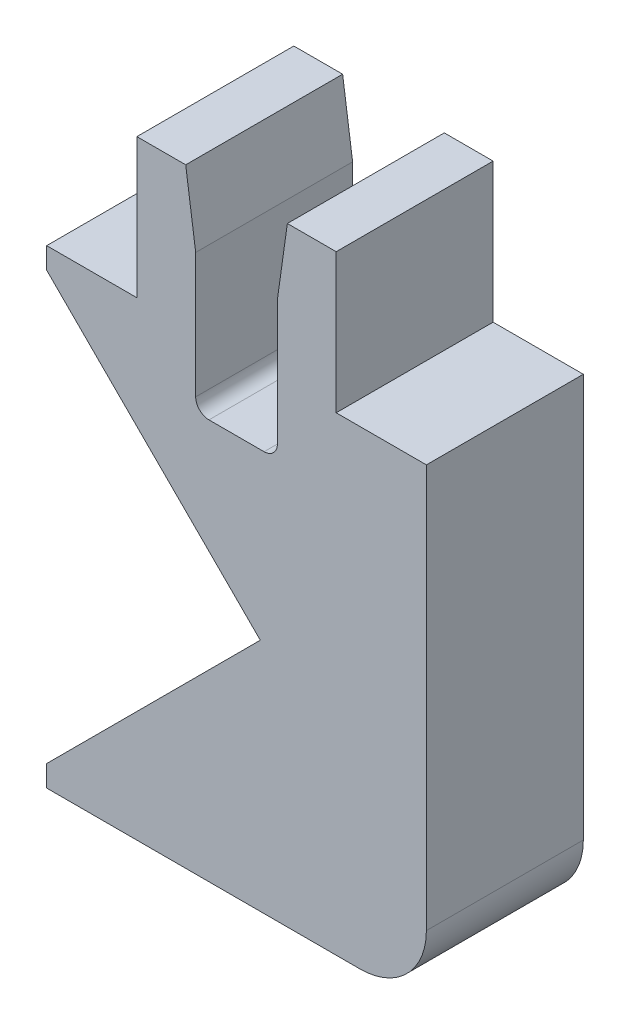
ISO-10303-21;
HEADER;
FILE_DESCRIPTION(('STEP AP214'),'2;1');
FILE_NAME('part.step','',(''),(''),'','','');
FILE_SCHEMA(('AUTOMOTIVE_DESIGN { 1 0 10303 214 1 1 1 1 }'));
ENDSEC;
DATA;
#1=APPLICATION_CONTEXT('core data for automotive mechanical design processes');
#2=APPLICATION_PROTOCOL_DEFINITION('international standard','automotive_design',2000,#1);
#3=PRODUCT_CONTEXT('',#1,'mechanical');
#4=PRODUCT('Part','Part','',(#3));
#5=PRODUCT_RELATED_PRODUCT_CATEGORY('part','',(#4));
#6=PRODUCT_DEFINITION_FORMATION('','',#4);
#7=PRODUCT_DEFINITION_CONTEXT('part definition',#1,'design');
#8=PRODUCT_DEFINITION('design','',#6,#7);
#9=PRODUCT_DEFINITION_SHAPE('','',#8);
#10=(LENGTH_UNIT() NAMED_UNIT(*) SI_UNIT(.MILLI.,.METRE.));
#11=(NAMED_UNIT(*) PLANE_ANGLE_UNIT() SI_UNIT($,.RADIAN.));
#12=(NAMED_UNIT(*) SI_UNIT($,.STERADIAN.) SOLID_ANGLE_UNIT());
#13=UNCERTAINTY_MEASURE_WITH_UNIT(LENGTH_MEASURE(1.E-05),#10,'distance_accuracy_value','');
#14=(GEOMETRIC_REPRESENTATION_CONTEXT(3) GLOBAL_UNCERTAINTY_ASSIGNED_CONTEXT((#13)) GLOBAL_UNIT_ASSIGNED_CONTEXT((#10,
#11,#12)) REPRESENTATION_CONTEXT('',''));
#15=CARTESIAN_POINT('',(0.,0.,0.));
#16=DIRECTION('',(0.,0.,1.));
#17=DIRECTION('',(1.,0.,0.));
#18=AXIS2_PLACEMENT_3D('',#15,#16,#17);
#19=CARTESIAN_POINT('',(-4.71872806053456,14.3142561210692,6.));
#20=DIRECTION('',(0.,-1.,0.));
#21=DIRECTION('',(0.,0.,-1.));
#22=AXIS2_PLACEMENT_3D('',#19,#20,#21);
#23=PLANE('',#22);
#24=DIRECTION('',(-1.,0.,0.));
#25=VECTOR('',#24,1.);
#26=CARTESIAN_POINT('',(-4.71872806053456,14.3142561210692,6.));
#27=LINE('',#26,#25);
#28=CARTESIAN_POINT('',(-2.85182806053456,14.3142561210692,6.));
#29=VERTEX_POINT('',#28);
#30=CARTESIAN_POINT('',(-4.71872806053456,14.3142561210692,6.));
#31=VERTEX_POINT('',#30);
#32=EDGE_CURVE('E282',#29,#31,#27,.T.);
#33=ORIENTED_EDGE('',*,*,#32,.F.);
#34=DIRECTION('',(0.,0.,-1.));
#35=VECTOR('',#34,1.);
#36=CARTESIAN_POINT('',(-2.85182806053456,14.3142561210692,6.));
#37=LINE('',#36,#35);
#38=CARTESIAN_POINT('',(-2.85182806053456,14.3142561210692,0.));
#39=VERTEX_POINT('',#38);
#40=EDGE_CURVE('E231',#29,#39,#37,.T.);
#41=ORIENTED_EDGE('',*,*,#40,.T.);
#42=DIRECTION('',(-1.,0.,0.));
#43=VECTOR('',#42,1.);
#44=CARTESIAN_POINT('',(-4.71872806053456,14.3142561210692,0.));
#45=LINE('',#44,#43);
#46=CARTESIAN_POINT('',(-4.71872806053456,14.3142561210692,0.));
#47=VERTEX_POINT('',#46);
#48=EDGE_CURVE('E305',#39,#47,#45,.T.);
#49=ORIENTED_EDGE('',*,*,#48,.T.);
#50=DIRECTION('',(0.,0.,-1.));
#51=VECTOR('',#50,1.);
#52=CARTESIAN_POINT('',(-4.71872806053456,14.3142561210692,6.));
#53=LINE('',#52,#51);
#54=EDGE_CURVE('E326',#31,#47,#53,.T.);
#55=ORIENTED_EDGE('',*,*,#54,.F.);
#56=EDGE_LOOP('',(#33,#41,#49,#55));
#57=FACE_BOUND('',#56,.T.);
#58=ADVANCED_FACE('F36',(#57),#23,.F.);
#59=CARTESIAN_POINT('',(-8.16745612106912,-8.16745612106902,6.));
#60=DIRECTION('',(0.707106781186544,-0.707106781186551,0.));
#61=DIRECTION('',(0.707106781186551,0.707106781186544,0.));
#62=AXIS2_PLACEMENT_3D('',#59,#60,#61);
#63=PLANE('',#62);
#64=DIRECTION('',(-0.707106781186551,-0.707106781186544,0.));
#65=VECTOR('',#64,1.);
#66=CARTESIAN_POINT('',(-8.16745612106912,-8.16745612106902,0.));
#67=LINE('',#66,#65);
#68=CARTESIAN_POINT('',(0.,0.,0.));
#69=VERTEX_POINT('',#68);
#70=CARTESIAN_POINT('',(-8.16745612106912,-8.16745612106902,0.));
#71=VERTEX_POINT('',#70);
#72=EDGE_CURVE('E198',#69,#71,#67,.T.);
#73=ORIENTED_EDGE('',*,*,#72,.T.);
#74=DIRECTION('',(0.,0.,-1.));
#75=VECTOR('',#74,1.);
#76=CARTESIAN_POINT('',(-8.16745612106912,-8.16745612106902,6.));
#77=LINE('',#76,#75);
#78=CARTESIAN_POINT('',(-8.16745612106912,-8.16745612106902,6.));
#79=VERTEX_POINT('',#78);
#80=EDGE_CURVE('E177',#79,#71,#77,.T.);
#81=ORIENTED_EDGE('',*,*,#80,.F.);
#82=DIRECTION('',(-0.707106781186551,-0.707106781186544,0.));
#83=VECTOR('',#82,1.);
#84=CARTESIAN_POINT('',(-8.16745612106912,-8.16745612106902,6.));
#85=LINE('',#84,#83);
#86=CARTESIAN_POINT('',(0.,0.,6.));
#87=VERTEX_POINT('',#86);
#88=EDGE_CURVE('E184',#87,#79,#85,.T.);
#89=ORIENTED_EDGE('',*,*,#88,.F.);
#90=DIRECTION('',(0.,0.,-1.));
#91=VECTOR('',#90,1.);
#92=CARTESIAN_POINT('',(0.,0.,6.));
#93=LINE('',#92,#91);
#94=EDGE_CURVE('E292',#87,#69,#93,.T.);
#95=ORIENTED_EDGE('',*,*,#94,.T.);
#96=EDGE_LOOP('',(#73,#81,#89,#95));
#97=FACE_BOUND('',#96,.T.);
#98=ADVANCED_FACE('F196',(#97),#63,.F.);
#99=CARTESIAN_POINT('',(-8.16745612106911,-8.98025612106903,6.));
#100=DIRECTION('',(1.,0.,0.));
#101=DIRECTION('',(0.,1.,0.));
#102=AXIS2_PLACEMENT_3D('',#99,#100,#101);
#103=PLANE('',#102);
#104=DIRECTION('',(0.,-1.,0.));
#105=VECTOR('',#104,1.);
#106=CARTESIAN_POINT('',(-8.16745612106911,-8.98025612106903,0.));
#107=LINE('',#106,#105);
#108=CARTESIAN_POINT('',(-8.16745612106911,-8.98025612106903,0.));
#109=VERTEX_POINT('',#108);
#110=EDGE_CURVE('E294',#71,#109,#107,.T.);
#111=ORIENTED_EDGE('',*,*,#110,.T.);
#112=DIRECTION('',(0.,0.,-1.));
#113=VECTOR('',#112,1.);
#114=CARTESIAN_POINT('',(-8.16745612106911,-8.98025612106903,6.));
#115=LINE('',#114,#113);
#116=CARTESIAN_POINT('',(-8.16745612106911,-8.98025612106903,6.));
#117=VERTEX_POINT('',#116);
#118=EDGE_CURVE('E180',#117,#109,#115,.T.);
#119=ORIENTED_EDGE('',*,*,#118,.F.);
#120=DIRECTION('',(0.,-1.,0.));
#121=VECTOR('',#120,1.);
#122=CARTESIAN_POINT('',(-8.16745612106911,-8.98025612106903,6.));
#123=LINE('',#122,#121);
#124=EDGE_CURVE('E173',#79,#117,#123,.T.);
#125=ORIENTED_EDGE('',*,*,#124,.F.);
#126=ORIENTED_EDGE('',*,*,#80,.T.);
#127=EDGE_LOOP('',(#111,#119,#125,#126));
#128=FACE_BOUND('',#127,.T.);
#129=ADVANCED_FACE('F175',(#128),#103,.F.);
#130=CARTESIAN_POINT('',(6.35,-8.98025612106902,6.));
#131=DIRECTION('',(0.,1.,0.));
#132=DIRECTION('',(-1.,0.,0.));
#133=AXIS2_PLACEMENT_3D('',#130,#131,#132);
#134=PLANE('',#133);
#135=DIRECTION('',(1.,0.,0.));
#136=VECTOR('',#135,1.);
#137=CARTESIAN_POINT('',(6.35,-8.98025612106902,0.));
#138=LINE('',#137,#136);
#139=CARTESIAN_POINT('',(3.81,-8.98025612106902,0.));
#140=VERTEX_POINT('',#139);
#141=EDGE_CURVE('E296',#109,#140,#138,.T.);
#142=ORIENTED_EDGE('',*,*,#141,.T.);
#143=DIRECTION('',(0.,0.,-1.));
#144=VECTOR('',#143,1.);
#145=CARTESIAN_POINT('',(3.81,-8.98025612106902,6.));
#146=LINE('',#145,#144);
#147=CARTESIAN_POINT('',(3.81,-8.98025612106902,6.));
#148=VERTEX_POINT('',#147);
#149=EDGE_CURVE('E209',#140,#148,#146,.F.);
#150=ORIENTED_EDGE('',*,*,#149,.T.);
#151=DIRECTION('',(1.,0.,0.));
#152=VECTOR('',#151,1.);
#153=CARTESIAN_POINT('',(6.35,-8.98025612106902,6.));
#154=LINE('',#153,#152);
#155=EDGE_CURVE('E183',#117,#148,#154,.T.);
#156=ORIENTED_EDGE('',*,*,#155,.F.);
#157=ORIENTED_EDGE('',*,*,#118,.T.);
#158=EDGE_LOOP('',(#142,#150,#156,#157));
#159=FACE_BOUND('',#158,.T.);
#160=ADVANCED_FACE('F362',(#159),#134,.F.);
#161=CARTESIAN_POINT('',(6.35,8.98025612106916,6.));
#162=DIRECTION('',(-1.,0.,0.));
#163=DIRECTION('',(0.,0.,1.));
#164=AXIS2_PLACEMENT_3D('',#161,#162,#163);
#165=PLANE('',#164);
#166=DIRECTION('',(0.,1.,0.));
#167=VECTOR('',#166,1.);
#168=CARTESIAN_POINT('',(6.35,8.98025612106916,6.));
#169=LINE('',#168,#167);
#170=CARTESIAN_POINT('',(6.35,-6.44025612106902,6.));
#171=VERTEX_POINT('',#170);
#172=CARTESIAN_POINT('',(6.35,8.98025612106916,6.));
#173=VERTEX_POINT('',#172);
#174=EDGE_CURVE('E276',#171,#173,#169,.T.);
#175=ORIENTED_EDGE('',*,*,#174,.F.);
#176=DIRECTION('',(0.,0.,-1.));
#177=VECTOR('',#176,1.);
#178=CARTESIAN_POINT('',(6.35,-6.44025612106902,6.));
#179=LINE('',#178,#177);
#180=CARTESIAN_POINT('',(6.35,-6.44025612106902,0.));
#181=VERTEX_POINT('',#180);
#182=EDGE_CURVE('E199',#171,#181,#179,.T.);
#183=ORIENTED_EDGE('',*,*,#182,.T.);
#184=DIRECTION('',(0.,1.,0.));
#185=VECTOR('',#184,1.);
#186=CARTESIAN_POINT('',(6.35,8.98025612106916,0.));
#187=LINE('',#186,#185);
#188=CARTESIAN_POINT('',(6.35,8.98025612106916,0.));
#189=VERTEX_POINT('',#188);
#190=EDGE_CURVE('E299',#181,#189,#187,.T.);
#191=ORIENTED_EDGE('',*,*,#190,.T.);
#192=DIRECTION('',(0.,0.,-1.));
#193=VECTOR('',#192,1.);
#194=CARTESIAN_POINT('',(6.35,8.98025612106916,6.));
#195=LINE('',#194,#193);
#196=EDGE_CURVE('E204',#173,#189,#195,.T.);
#197=ORIENTED_EDGE('',*,*,#196,.F.);
#198=EDGE_LOOP('',(#175,#183,#191,#197));
#199=FACE_BOUND('',#198,.T.);
#200=ADVANCED_FACE('F356',(#199),#165,.F.);
#201=CARTESIAN_POINT('',(2.90127193946544,8.98025612106916,6.));
#202=DIRECTION('',(0.,-1.,0.));
#203=DIRECTION('',(0.,0.,-1.));
#204=AXIS2_PLACEMENT_3D('',#201,#202,#203);
#205=PLANE('',#204);
#206=DIRECTION('',(-1.,0.,0.));
#207=VECTOR('',#206,1.);
#208=CARTESIAN_POINT('',(2.90127193946544,8.98025612106916,0.));
#209=LINE('',#208,#207);
#210=CARTESIAN_POINT('',(2.90127193946544,8.98025612106916,0.));
#211=VERTEX_POINT('',#210);
#212=EDGE_CURVE('E301',#189,#211,#209,.T.);
#213=ORIENTED_EDGE('',*,*,#212,.T.);
#214=DIRECTION('',(0.,0.,-1.));
#215=VECTOR('',#214,1.);
#216=CARTESIAN_POINT('',(2.90127193946544,8.98025612106916,6.));
#217=LINE('',#216,#215);
#218=CARTESIAN_POINT('',(2.90127193946544,8.98025612106916,6.));
#219=VERTEX_POINT('',#218);
#220=EDGE_CURVE('E332',#219,#211,#217,.T.);
#221=ORIENTED_EDGE('',*,*,#220,.F.);
#222=DIRECTION('',(-1.,0.,0.));
#223=VECTOR('',#222,1.);
#224=CARTESIAN_POINT('',(2.90127193946544,8.98025612106916,6.));
#225=LINE('',#224,#223);
#226=EDGE_CURVE('E278',#173,#219,#225,.T.);
#227=ORIENTED_EDGE('',*,*,#226,.F.);
#228=ORIENTED_EDGE('',*,*,#196,.T.);
#229=EDGE_LOOP('',(#213,#221,#227,#228));
#230=FACE_BOUND('',#229,.T.);
#231=ADVANCED_FACE('F339',(#230),#205,.F.);
#232=CARTESIAN_POINT('',(2.90127193946544,14.3142561210692,6.));
#233=DIRECTION('',(-1.,0.,0.));
#234=DIRECTION('',(0.,-1.,0.));
#235=AXIS2_PLACEMENT_3D('',#232,#233,#234);
#236=PLANE('',#235);
#237=DIRECTION('',(0.,1.,0.));
#238=VECTOR('',#237,1.);
#239=CARTESIAN_POINT('',(2.90127193946544,14.3142561210692,0.));
#240=LINE('',#239,#238);
#241=CARTESIAN_POINT('',(2.90127193946544,14.3142561210692,0.));
#242=VERTEX_POINT('',#241);
#243=EDGE_CURVE('E303',#211,#242,#240,.T.);
#244=ORIENTED_EDGE('',*,*,#243,.T.);
#245=DIRECTION('',(0.,0.,-1.));
#246=VECTOR('',#245,1.);
#247=CARTESIAN_POINT('',(2.90127193946544,14.3142561210692,6.));
#248=LINE('',#247,#246);
#249=CARTESIAN_POINT('',(2.90127193946544,14.3142561210692,6.));
#250=VERTEX_POINT('',#249);
#251=EDGE_CURVE('E329',#250,#242,#248,.T.);
#252=ORIENTED_EDGE('',*,*,#251,.F.);
#253=DIRECTION('',(0.,1.,0.));
#254=VECTOR('',#253,1.);
#255=CARTESIAN_POINT('',(2.90127193946544,14.3142561210692,6.));
#256=LINE('',#255,#254);
#257=EDGE_CURVE('E280',#219,#250,#256,.T.);
#258=ORIENTED_EDGE('',*,*,#257,.F.);
#259=ORIENTED_EDGE('',*,*,#220,.T.);
#260=EDGE_LOOP('',(#244,#252,#258,#259));
#261=FACE_BOUND('',#260,.T.);
#262=ADVANCED_FACE('F348',(#261),#236,.F.);
#263=CARTESIAN_POINT('',(1.03437193946544,14.3142561210692,0.));
#264=VERTEX_POINT('',#263);
#265=EDGE_CURVE('E306',#242,#264,#45,.T.);
#266=ORIENTED_EDGE('',*,*,#265,.T.);
#267=DIRECTION('',(0.,0.,1.));
#268=VECTOR('',#267,1.);
#269=CARTESIAN_POINT('',(1.03437193946544,14.3142561210692,6.));
#270=LINE('',#269,#268);
#271=CARTESIAN_POINT('',(1.03437193946544,14.3142561210692,6.));
#272=VERTEX_POINT('',#271);
#273=EDGE_CURVE('E213',#264,#272,#270,.T.);
#274=ORIENTED_EDGE('',*,*,#273,.T.);
#275=EDGE_CURVE('E283',#250,#272,#27,.T.);
#276=ORIENTED_EDGE('',*,*,#275,.F.);
#277=ORIENTED_EDGE('',*,*,#251,.T.);
#278=EDGE_LOOP('',(#266,#274,#276,#277));
#279=FACE_BOUND('',#278,.T.);
#280=ADVANCED_FACE('F352',(#279),#23,.F.);
#281=CARTESIAN_POINT('',(-4.71872806053456,8.98025612106916,6.));
#282=DIRECTION('',(1.,0.,0.));
#283=DIRECTION('',(0.,0.,-1.));
#284=AXIS2_PLACEMENT_3D('',#281,#282,#283);
#285=PLANE('',#284);
#286=DIRECTION('',(0.,-1.,0.));
#287=VECTOR('',#286,1.);
#288=CARTESIAN_POINT('',(-4.71872806053456,8.98025612106916,0.));
#289=LINE('',#288,#287);
#290=CARTESIAN_POINT('',(-4.71872806053456,8.98025612106916,0.));
#291=VERTEX_POINT('',#290);
#292=EDGE_CURVE('E309',#47,#291,#289,.T.);
#293=ORIENTED_EDGE('',*,*,#292,.T.);
#294=DIRECTION('',(0.,0.,-1.));
#295=VECTOR('',#294,1.);
#296=CARTESIAN_POINT('',(-4.71872806053456,8.98025612106916,6.));
#297=LINE('',#296,#295);
#298=CARTESIAN_POINT('',(-4.71872806053456,8.98025612106916,6.));
#299=VERTEX_POINT('',#298);
#300=EDGE_CURVE('E323',#299,#291,#297,.T.);
#301=ORIENTED_EDGE('',*,*,#300,.F.);
#302=DIRECTION('',(0.,-1.,0.));
#303=VECTOR('',#302,1.);
#304=CARTESIAN_POINT('',(-4.71872806053456,8.98025612106916,6.));
#305=LINE('',#304,#303);
#306=EDGE_CURVE('E285',#31,#299,#305,.T.);
#307=ORIENTED_EDGE('',*,*,#306,.F.);
#308=ORIENTED_EDGE('',*,*,#54,.T.);
#309=EDGE_LOOP('',(#293,#301,#307,#308));
#310=FACE_BOUND('',#309,.T.);
#311=ADVANCED_FACE('F382',(#310),#285,.F.);
#312=CARTESIAN_POINT('',(-8.16745612106912,8.9802561210692,6.));
#313=DIRECTION('',(0.,-1.,0.));
#314=DIRECTION('',(1.,0.,0.));
#315=AXIS2_PLACEMENT_3D('',#312,#313,#314);
#316=PLANE('',#315);
#317=DIRECTION('',(-1.,0.,0.));
#318=VECTOR('',#317,1.);
#319=CARTESIAN_POINT('',(-8.16745612106912,8.9802561210692,0.));
#320=LINE('',#319,#318);
#321=CARTESIAN_POINT('',(-8.16745612106912,8.9802561210692,0.));
#322=VERTEX_POINT('',#321);
#323=EDGE_CURVE('E311',#291,#322,#320,.T.);
#324=ORIENTED_EDGE('',*,*,#323,.T.);
#325=DIRECTION('',(0.,0.,-1.));
#326=VECTOR('',#325,1.);
#327=CARTESIAN_POINT('',(-8.16745612106912,8.9802561210692,6.));
#328=LINE('',#327,#326);
#329=CARTESIAN_POINT('',(-8.16745612106912,8.9802561210692,6.));
#330=VERTEX_POINT('',#329);
#331=EDGE_CURVE('E320',#330,#322,#328,.T.);
#332=ORIENTED_EDGE('',*,*,#331,.F.);
#333=DIRECTION('',(-1.,0.,0.));
#334=VECTOR('',#333,1.);
#335=CARTESIAN_POINT('',(-8.16745612106912,8.9802561210692,6.));
#336=LINE('',#335,#334);
#337=EDGE_CURVE('E287',#299,#330,#336,.T.);
#338=ORIENTED_EDGE('',*,*,#337,.F.);
#339=ORIENTED_EDGE('',*,*,#300,.T.);
#340=EDGE_LOOP('',(#324,#332,#338,#339));
#341=FACE_BOUND('',#340,.T.);
#342=ADVANCED_FACE('F387',(#341),#316,.F.);
#343=CARTESIAN_POINT('',(-8.16745612106911,8.1674561210692,6.));
#344=DIRECTION('',(1.,0.,0.));
#345=DIRECTION('',(0.,1.,0.));
#346=AXIS2_PLACEMENT_3D('',#343,#344,#345);
#347=PLANE('',#346);
#348=DIRECTION('',(0.,-1.,0.));
#349=VECTOR('',#348,1.);
#350=CARTESIAN_POINT('',(-8.16745612106911,8.1674561210692,0.));
#351=LINE('',#350,#349);
#352=CARTESIAN_POINT('',(-8.16745612106911,8.1674561210692,0.));
#353=VERTEX_POINT('',#352);
#354=EDGE_CURVE('E313',#322,#353,#351,.T.);
#355=ORIENTED_EDGE('',*,*,#354,.T.);
#356=DIRECTION('',(0.,0.,-1.));
#357=VECTOR('',#356,1.);
#358=CARTESIAN_POINT('',(-8.16745612106911,8.1674561210692,6.));
#359=LINE('',#358,#357);
#360=CARTESIAN_POINT('',(-8.16745612106911,8.1674561210692,6.));
#361=VERTEX_POINT('',#360);
#362=EDGE_CURVE('E317',#361,#353,#359,.T.);
#363=ORIENTED_EDGE('',*,*,#362,.F.);
#364=DIRECTION('',(0.,-1.,0.));
#365=VECTOR('',#364,1.);
#366=CARTESIAN_POINT('',(-8.16745612106911,8.1674561210692,6.));
#367=LINE('',#366,#365);
#368=EDGE_CURVE('E289',#330,#361,#367,.T.);
#369=ORIENTED_EDGE('',*,*,#368,.F.);
#370=ORIENTED_EDGE('',*,*,#331,.T.);
#371=EDGE_LOOP('',(#355,#363,#369,#370));
#372=FACE_BOUND('',#371,.T.);
#373=ADVANCED_FACE('F523',(#372),#347,.F.);
#374=CARTESIAN_POINT('',(0.,0.,6.));
#375=DIRECTION('',(0.707106781186551,0.707106781186544,0.));
#376=DIRECTION('',(-0.707106781186544,0.707106781186551,0.));
#377=AXIS2_PLACEMENT_3D('',#374,#375,#376);
#378=PLANE('',#377);
#379=DIRECTION('',(0.707106781186544,-0.707106781186551,0.));
#380=VECTOR('',#379,1.);
#381=CARTESIAN_POINT('',(0.,0.,0.));
#382=LINE('',#381,#380);
#383=EDGE_CURVE('E194',#353,#69,#382,.T.);
#384=ORIENTED_EDGE('',*,*,#383,.T.);
#385=ORIENTED_EDGE('',*,*,#94,.F.);
#386=DIRECTION('',(0.707106781186544,-0.707106781186551,0.));
#387=VECTOR('',#386,1.);
#388=CARTESIAN_POINT('',(0.,0.,6.));
#389=LINE('',#388,#387);
#390=EDGE_CURVE('E190',#361,#87,#389,.T.);
#391=ORIENTED_EDGE('',*,*,#390,.F.);
#392=ORIENTED_EDGE('',*,*,#362,.T.);
#393=EDGE_LOOP('',(#384,#385,#391,#392));
#394=FACE_BOUND('',#393,.T.);
#395=ADVANCED_FACE('F459',(#394),#378,.F.);
#396=CARTESIAN_POINT('',(0.,0.,6.));
#397=DIRECTION('',(0.,0.,1.));
#398=DIRECTION('',(1.,0.,0.));
#399=AXIS2_PLACEMENT_3D('',#396,#397,#398);
#400=PLANE('',#399);
#401=ORIENTED_EDGE('',*,*,#275,.T.);
#402=DIRECTION('',(0.139173100960067,0.99026806874157,0.));
#403=VECTOR('',#402,1.);
#404=CARTESIAN_POINT('',(-0.958434821735926,0.134699229854606,6.));
#405=LINE('',#404,#403);
#406=CARTESIAN_POINT('',(0.653371939465443,11.6033002568408,6.));
#407=VERTEX_POINT('',#406);
#408=EDGE_CURVE('E218',#272,#407,#405,.F.);
#409=ORIENTED_EDGE('',*,*,#408,.T.);
#410=DIRECTION('',(0.,1.,0.));
#411=VECTOR('',#410,1.);
#412=CARTESIAN_POINT('',(0.653371939465443,14.3142561210692,6.));
#413=LINE('',#412,#411);
#414=CARTESIAN_POINT('',(0.653371939465442,6.82125612106916,6.));
#415=VERTEX_POINT('',#414);
#416=EDGE_CURVE('E265',#415,#407,#413,.T.);
#417=ORIENTED_EDGE('',*,*,#416,.F.);
#418=CARTESIAN_POINT('',(0.145371939465442,6.82125612106916,6.));
#419=DIRECTION('',(0.,0.,1.));
#420=DIRECTION('',(1.,0.,0.));
#421=AXIS2_PLACEMENT_3D('',#418,#419,#420);
#422=CIRCLE('',#421,0.508);
#423=CARTESIAN_POINT('',(0.145371939465443,6.31325612106916,6.));
#424=VERTEX_POINT('',#423);
#425=EDGE_CURVE('E242',#415,#424,#422,.F.);
#426=ORIENTED_EDGE('',*,*,#425,.T.);
#427=DIRECTION('',(1.,0.,0.));
#428=VECTOR('',#427,1.);
#429=CARTESIAN_POINT('',(-2.47082806053456,6.31325612106916,6.));
#430=LINE('',#429,#428);
#431=CARTESIAN_POINT('',(-1.96282806053456,6.31325612106916,6.));
#432=VERTEX_POINT('',#431);
#433=EDGE_CURVE('E264',#432,#424,#430,.T.);
#434=ORIENTED_EDGE('',*,*,#433,.F.);
#435=CARTESIAN_POINT('',(-1.96282806053456,6.82125612106916,6.));
#436=DIRECTION('',(0.,0.,1.));
#437=DIRECTION('',(1.,0.,0.));
#438=AXIS2_PLACEMENT_3D('',#435,#436,#437);
#439=CIRCLE('',#438,0.508);
#440=CARTESIAN_POINT('',(-2.47082806053456,6.82125612106916,6.));
#441=VERTEX_POINT('',#440);
#442=EDGE_CURVE('E44',#432,#441,#439,.F.);
#443=ORIENTED_EDGE('',*,*,#442,.T.);
#444=DIRECTION('',(0.,-1.,0.));
#445=VECTOR('',#444,1.);
#446=CARTESIAN_POINT('',(-2.47082806053456,14.3142561210692,6.));
#447=LINE('',#446,#445);
#448=CARTESIAN_POINT('',(-2.47082806053456,11.6033002568408,6.));
#449=VERTEX_POINT('',#448);
#450=EDGE_CURVE('E269',#449,#441,#447,.T.);
#451=ORIENTED_EDGE('',*,*,#450,.F.);
#452=DIRECTION('',(0.139173100960068,-0.99026806874157,0.));
#453=VECTOR('',#452,1.);
#454=CARTESIAN_POINT('',(-0.823818715414818,-0.115780169907853,6.));
#455=LINE('',#454,#453);
#456=EDGE_CURVE('E216',#449,#29,#455,.F.);
#457=ORIENTED_EDGE('',*,*,#456,.T.);
#458=ORIENTED_EDGE('',*,*,#32,.T.);
#459=ORIENTED_EDGE('',*,*,#306,.T.);
#460=ORIENTED_EDGE('',*,*,#337,.T.);
#461=ORIENTED_EDGE('',*,*,#368,.T.);
#462=ORIENTED_EDGE('',*,*,#390,.T.);
#463=ORIENTED_EDGE('',*,*,#88,.T.);
#464=ORIENTED_EDGE('',*,*,#124,.T.);
#465=ORIENTED_EDGE('',*,*,#155,.T.);
#466=CARTESIAN_POINT('',(3.81,-6.44025612106902,6.));
#467=DIRECTION('',(0.,0.,1.));
#468=DIRECTION('',(1.,0.,0.));
#469=AXIS2_PLACEMENT_3D('',#466,#467,#468);
#470=CIRCLE('',#469,2.54);
#471=EDGE_CURVE('E211',#148,#171,#470,.T.);
#472=ORIENTED_EDGE('',*,*,#471,.T.);
#473=ORIENTED_EDGE('',*,*,#174,.T.);
#474=ORIENTED_EDGE('',*,*,#226,.T.);
#475=ORIENTED_EDGE('',*,*,#257,.T.);
#476=EDGE_LOOP('',(#401,#409,#417,#426,#434,#443,#451,#457,#458,#459,#460,#461,#462,#463,#464,
#465,#472,#473,#474,#475));
#477=FACE_BOUND('',#476,.T.);
#478=ADVANCED_FACE('F188',(#477),#400,.T.);
#479=CARTESIAN_POINT('',(0.,0.,0.));
#480=DIRECTION('',(0.,0.,1.));
#481=DIRECTION('',(1.,0.,0.));
#482=AXIS2_PLACEMENT_3D('',#479,#480,#481);
#483=PLANE('',#482);
#484=DIRECTION('',(1.,0.,0.));
#485=VECTOR('',#484,1.);
#486=CARTESIAN_POINT('',(-2.47082806053456,6.31325612106916,0.));
#487=LINE('',#486,#485);
#488=CARTESIAN_POINT('',(-1.96282806053456,6.31325612106916,0.));
#489=VERTEX_POINT('',#488);
#490=CARTESIAN_POINT('',(0.145371939465443,6.31325612106916,0.));
#491=VERTEX_POINT('',#490);
#492=EDGE_CURVE('E252',#489,#491,#487,.T.);
#493=ORIENTED_EDGE('',*,*,#492,.T.);
#494=CARTESIAN_POINT('',(0.145371939465442,6.82125612106916,0.));
#495=DIRECTION('',(0.,0.,1.));
#496=DIRECTION('',(1.,0.,0.));
#497=AXIS2_PLACEMENT_3D('',#494,#495,#496);
#498=CIRCLE('',#497,0.508);
#499=CARTESIAN_POINT('',(0.653371939465442,6.82125612106916,0.));
#500=VERTEX_POINT('',#499);
#501=EDGE_CURVE('E244',#491,#500,#498,.T.);
#502=ORIENTED_EDGE('',*,*,#501,.T.);
#503=DIRECTION('',(0.,1.,0.));
#504=VECTOR('',#503,1.);
#505=CARTESIAN_POINT('',(0.653371939465443,14.3142561210692,0.));
#506=LINE('',#505,#504);
#507=CARTESIAN_POINT('',(0.653371939465443,11.6033002568408,0.));
#508=VERTEX_POINT('',#507);
#509=EDGE_CURVE('E250',#500,#508,#506,.T.);
#510=ORIENTED_EDGE('',*,*,#509,.T.);
#511=DIRECTION('',(-0.139173100960067,-0.99026806874157,0.));
#512=VECTOR('',#511,1.);
#513=CARTESIAN_POINT('',(1.03437193946544,14.3142561210692,0.));
#514=LINE('',#513,#512);
#515=EDGE_CURVE('E226',#508,#264,#514,.F.);
#516=ORIENTED_EDGE('',*,*,#515,.T.);
#517=ORIENTED_EDGE('',*,*,#265,.F.);
#518=ORIENTED_EDGE('',*,*,#243,.F.);
#519=ORIENTED_EDGE('',*,*,#212,.F.);
#520=ORIENTED_EDGE('',*,*,#190,.F.);
#521=CARTESIAN_POINT('',(3.81,-6.44025612106902,0.));
#522=DIRECTION('',(0.,0.,1.));
#523=DIRECTION('',(1.,0.,0.));
#524=AXIS2_PLACEMENT_3D('',#521,#522,#523);
#525=CIRCLE('',#524,2.54);
#526=EDGE_CURVE('E202',#181,#140,#525,.F.);
#527=ORIENTED_EDGE('',*,*,#526,.T.);
#528=ORIENTED_EDGE('',*,*,#141,.F.);
#529=ORIENTED_EDGE('',*,*,#110,.F.);
#530=ORIENTED_EDGE('',*,*,#72,.F.);
#531=ORIENTED_EDGE('',*,*,#383,.F.);
#532=ORIENTED_EDGE('',*,*,#354,.F.);
#533=ORIENTED_EDGE('',*,*,#323,.F.);
#534=ORIENTED_EDGE('',*,*,#292,.F.);
#535=ORIENTED_EDGE('',*,*,#48,.F.);
#536=DIRECTION('',(-0.139173100960068,0.99026806874157,0.));
#537=VECTOR('',#536,1.);
#538=CARTESIAN_POINT('',(-2.47082806053456,11.6033002568408,0.));
#539=LINE('',#538,#537);
#540=CARTESIAN_POINT('',(-2.47082806053456,11.6033002568408,0.));
#541=VERTEX_POINT('',#540);
#542=EDGE_CURVE('E224',#39,#541,#539,.F.);
#543=ORIENTED_EDGE('',*,*,#542,.T.);
#544=DIRECTION('',(0.,-1.,0.));
#545=VECTOR('',#544,1.);
#546=CARTESIAN_POINT('',(-2.47082806053456,14.3142561210692,0.));
#547=LINE('',#546,#545);
#548=CARTESIAN_POINT('',(-2.47082806053456,6.82125612106916,0.));
#549=VERTEX_POINT('',#548);
#550=EDGE_CURVE('E271',#541,#549,#547,.T.);
#551=ORIENTED_EDGE('',*,*,#550,.T.);
#552=CARTESIAN_POINT('',(-1.96282806053456,6.82125612106916,0.));
#553=DIRECTION('',(0.,0.,1.));
#554=DIRECTION('',(1.,0.,0.));
#555=AXIS2_PLACEMENT_3D('',#552,#553,#554);
#556=CIRCLE('',#555,0.508);
#557=EDGE_CURVE('E11',#549,#489,#556,.T.);
#558=ORIENTED_EDGE('',*,*,#557,.T.);
#559=EDGE_LOOP('',(#493,#502,#510,#516,#517,#518,#519,#520,#527,#528,#529,#530,#531,#532,#533,
#534,#535,#543,#551,#558));
#560=FACE_BOUND('',#559,.T.);
#561=ADVANCED_FACE('F249',(#560),#483,.F.);
#562=CARTESIAN_POINT('',(3.81,-6.44025612106902,6.));
#563=DIRECTION('',(0.,0.,-1.));
#564=DIRECTION('',(-1.,0.,0.));
#565=AXIS2_PLACEMENT_3D('',#562,#563,#564);
#566=CYLINDRICAL_SURFACE('',#565,2.54);
#567=ORIENTED_EDGE('',*,*,#471,.F.);
#568=ORIENTED_EDGE('',*,*,#149,.F.);
#569=ORIENTED_EDGE('',*,*,#526,.F.);
#570=ORIENTED_EDGE('',*,*,#182,.F.);
#571=EDGE_LOOP('',(#567,#568,#569,#570));
#572=FACE_BOUND('',#571,.T.);
#573=ADVANCED_FACE('F358',(#572),#566,.T.);
#574=CARTESIAN_POINT('',(-2.47082806053456,14.3142561210692,0.));
#575=DIRECTION('',(-1.,0.,0.));
#576=DIRECTION('',(0.,-1.,0.));
#577=AXIS2_PLACEMENT_3D('',#574,#575,#576);
#578=PLANE('',#577);
#579=ORIENTED_EDGE('',*,*,#450,.T.);
#580=DIRECTION('',(0.,0.,1.));
#581=VECTOR('',#580,1.);
#582=CARTESIAN_POINT('',(-2.47082806053456,6.82125612106916,0.));
#583=LINE('',#582,#581);
#584=EDGE_CURVE('E57',#441,#549,#583,.F.);
#585=ORIENTED_EDGE('',*,*,#584,.T.);
#586=ORIENTED_EDGE('',*,*,#550,.F.);
#587=DIRECTION('',(0.,0.,1.));
#588=VECTOR('',#587,1.);
#589=CARTESIAN_POINT('',(-2.47082806053456,11.6033002568408,0.));
#590=LINE('',#589,#588);
#591=EDGE_CURVE('E228',#541,#449,#590,.T.);
#592=ORIENTED_EDGE('',*,*,#591,.T.);
#593=EDGE_LOOP('',(#579,#585,#586,#592));
#594=FACE_BOUND('',#593,.T.);
#595=ADVANCED_FACE('F411',(#594),#578,.F.);
#596=CARTESIAN_POINT('',(0.653371939465443,14.3142561210692,0.));
#597=DIRECTION('',(1.,0.,0.));
#598=DIRECTION('',(0.,1.,0.));
#599=AXIS2_PLACEMENT_3D('',#596,#597,#598);
#600=PLANE('',#599);
#601=ORIENTED_EDGE('',*,*,#509,.F.);
#602=DIRECTION('',(0.,0.,1.));
#603=VECTOR('',#602,1.);
#604=CARTESIAN_POINT('',(0.653371939465442,6.82125612106916,6.));
#605=LINE('',#604,#603);
#606=EDGE_CURVE('E233',#500,#415,#605,.T.);
#607=ORIENTED_EDGE('',*,*,#606,.T.);
#608=ORIENTED_EDGE('',*,*,#416,.T.);
#609=DIRECTION('',(0.,0.,-1.));
#610=VECTOR('',#609,1.);
#611=CARTESIAN_POINT('',(0.653371939465443,11.6033002568408,0.));
#612=LINE('',#611,#610);
#613=EDGE_CURVE('E221',#407,#508,#612,.T.);
#614=ORIENTED_EDGE('',*,*,#613,.T.);
#615=EDGE_LOOP('',(#601,#607,#608,#614));
#616=FACE_BOUND('',#615,.T.);
#617=ADVANCED_FACE('F257',(#616),#600,.F.);
#618=CARTESIAN_POINT('',(-2.47082806053456,6.31325612106916,0.));
#619=DIRECTION('',(0.,-1.,0.));
#620=DIRECTION('',(0.,0.,-1.));
#621=AXIS2_PLACEMENT_3D('',#618,#619,#620);
#622=PLANE('',#621);
#623=ORIENTED_EDGE('',*,*,#433,.T.);
#624=DIRECTION('',(0.,0.,1.));
#625=VECTOR('',#624,1.);
#626=CARTESIAN_POINT('',(0.145371939465442,6.31325612106916,0.));
#627=LINE('',#626,#625);
#628=EDGE_CURVE('E239',#424,#491,#627,.F.);
#629=ORIENTED_EDGE('',*,*,#628,.T.);
#630=ORIENTED_EDGE('',*,*,#492,.F.);
#631=DIRECTION('',(0.,0.,1.));
#632=VECTOR('',#631,1.);
#633=CARTESIAN_POINT('',(-1.96282806053456,6.31325612106916,6.));
#634=LINE('',#633,#632);
#635=EDGE_CURVE('E236',#489,#432,#634,.T.);
#636=ORIENTED_EDGE('',*,*,#635,.T.);
#637=EDGE_LOOP('',(#623,#629,#630,#636));
#638=FACE_BOUND('',#637,.T.);
#639=ADVANCED_FACE('F267',(#638),#622,.F.);
#640=CARTESIAN_POINT('',(1.03437193946544,14.3142561210692,6.));
#641=DIRECTION('',(0.99026806874157,-0.139173100960067,0.));
#642=DIRECTION('',(0.139173100960067,0.99026806874157,0.));
#643=AXIS2_PLACEMENT_3D('',#640,#641,#642);
#644=PLANE('',#643);
#645=ORIENTED_EDGE('',*,*,#515,.F.);
#646=ORIENTED_EDGE('',*,*,#613,.F.);
#647=ORIENTED_EDGE('',*,*,#408,.F.);
#648=ORIENTED_EDGE('',*,*,#273,.F.);
#649=EDGE_LOOP('',(#645,#646,#647,#648));
#650=FACE_BOUND('',#649,.T.);
#651=ADVANCED_FACE('F431',(#650),#644,.F.);
#652=CARTESIAN_POINT('',(-2.47082806053456,11.6033002568408,0.));
#653=DIRECTION('',(-0.99026806874157,-0.139173100960068,0.));
#654=DIRECTION('',(0.139173100960068,-0.99026806874157,0.));
#655=AXIS2_PLACEMENT_3D('',#652,#653,#654);
#656=PLANE('',#655);
#657=ORIENTED_EDGE('',*,*,#542,.F.);
#658=ORIENTED_EDGE('',*,*,#40,.F.);
#659=ORIENTED_EDGE('',*,*,#456,.F.);
#660=ORIENTED_EDGE('',*,*,#591,.F.);
#661=EDGE_LOOP('',(#657,#658,#659,#660));
#662=FACE_BOUND('',#661,.T.);
#663=ADVANCED_FACE('F436',(#662),#656,.F.);
#664=CARTESIAN_POINT('',(0.145371939465442,6.82125612106916,0.));
#665=DIRECTION('',(0.,0.,-1.));
#666=DIRECTION('',(-1.,0.,0.));
#667=AXIS2_PLACEMENT_3D('',#664,#665,#666);
#668=CYLINDRICAL_SURFACE('',#667,0.508);
#669=ORIENTED_EDGE('',*,*,#501,.F.);
#670=ORIENTED_EDGE('',*,*,#628,.F.);
#671=ORIENTED_EDGE('',*,*,#425,.F.);
#672=ORIENTED_EDGE('',*,*,#606,.F.);
#673=EDGE_LOOP('',(#669,#670,#671,#672));
#674=FACE_BOUND('',#673,.T.);
#675=ADVANCED_FACE('F262',(#674),#668,.F.);
#676=CARTESIAN_POINT('',(-1.96282806053456,6.82125612106916,0.));
#677=DIRECTION('',(0.,0.,-1.));
#678=DIRECTION('',(-1.,0.,0.));
#679=AXIS2_PLACEMENT_3D('',#676,#677,#678);
#680=CYLINDRICAL_SURFACE('',#679,0.508);
#681=ORIENTED_EDGE('',*,*,#557,.F.);
#682=ORIENTED_EDGE('',*,*,#584,.F.);
#683=ORIENTED_EDGE('',*,*,#442,.F.);
#684=ORIENTED_EDGE('',*,*,#635,.F.);
#685=EDGE_LOOP('',(#681,#682,#683,#684));
#686=FACE_BOUND('',#685,.T.);
#687=ADVANCED_FACE('F38',(#686),#680,.F.);
#688=CLOSED_SHELL('',(#58,#98,#129,#160,#200,#231,#262,#280,#311,#342,#373,#395,#478,#561,#573,
#595,#617,#639,#651,#663,#675,#687));
#689=MANIFOLD_SOLID_BREP('B2',#688);
#690=ADVANCED_BREP_SHAPE_REPRESENTATION('',(#18,#689),#14);
#691=SHAPE_DEFINITION_REPRESENTATION(#9,#690);
ENDSEC;
END-ISO-10303-21;
